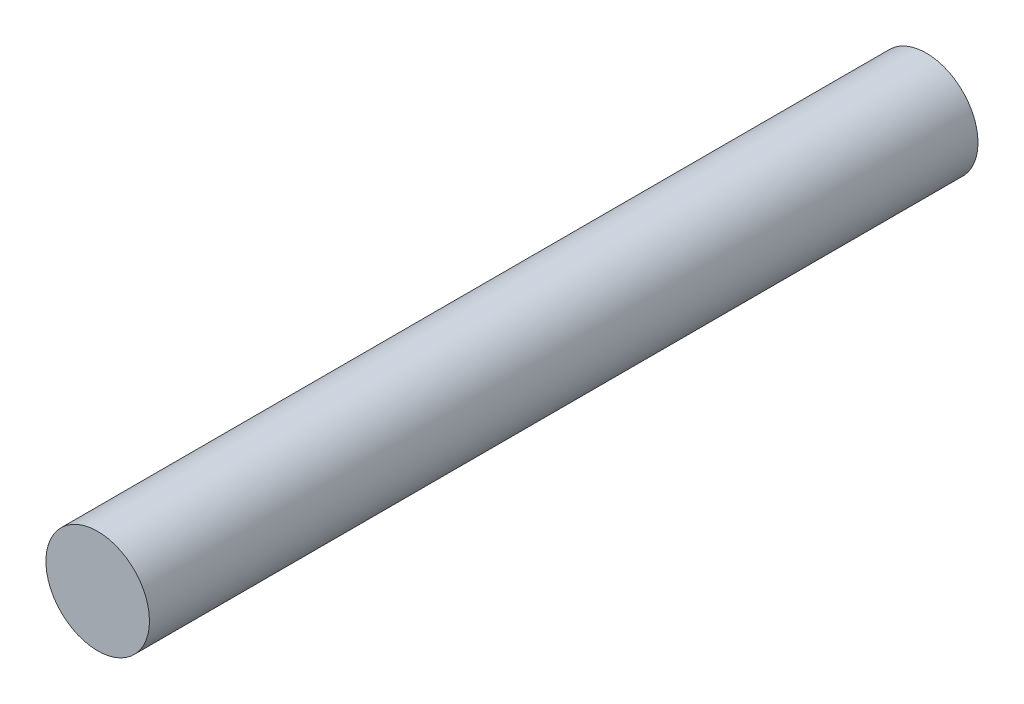
ISO-10303-21;
HEADER;
FILE_DESCRIPTION(('STEP AP214'),'2;1');
FILE_NAME('part.step','',(''),(''),'','','');
FILE_SCHEMA(('AUTOMOTIVE_DESIGN { 1 0 10303 214 1 1 1 1 }'));
ENDSEC;
DATA;
#1=APPLICATION_CONTEXT('core data for automotive mechanical design processes');
#2=APPLICATION_PROTOCOL_DEFINITION('international standard','automotive_design',2000,#1);
#3=PRODUCT_CONTEXT('',#1,'mechanical');
#4=PRODUCT('Part','Part','',(#3));
#5=PRODUCT_RELATED_PRODUCT_CATEGORY('part','',(#4));
#6=PRODUCT_DEFINITION_FORMATION('','',#4);
#7=PRODUCT_DEFINITION_CONTEXT('part definition',#1,'design');
#8=PRODUCT_DEFINITION('design','',#6,#7);
#9=PRODUCT_DEFINITION_SHAPE('','',#8);
#10=(LENGTH_UNIT() NAMED_UNIT(*) SI_UNIT(.MILLI.,.METRE.));
#11=(NAMED_UNIT(*) PLANE_ANGLE_UNIT() SI_UNIT($,.RADIAN.));
#12=(NAMED_UNIT(*) SI_UNIT($,.STERADIAN.) SOLID_ANGLE_UNIT());
#13=UNCERTAINTY_MEASURE_WITH_UNIT(LENGTH_MEASURE(1.E-05),#10,'distance_accuracy_value','');
#14=(GEOMETRIC_REPRESENTATION_CONTEXT(3) GLOBAL_UNCERTAINTY_ASSIGNED_CONTEXT((#13)) GLOBAL_UNIT_ASSIGNED_CONTEXT((#10,
#11,#12)) REPRESENTATION_CONTEXT('',''));
#15=CARTESIAN_POINT('',(0.,0.,0.));
#16=DIRECTION('',(0.,0.,1.));
#17=DIRECTION('',(1.,0.,0.));
#18=AXIS2_PLACEMENT_3D('',#15,#16,#17);
#19=CARTESIAN_POINT('',(0.,0.,25.4));
#20=DIRECTION('',(0.,0.,-1.));
#21=DIRECTION('',(-1.,0.,0.));
#22=AXIS2_PLACEMENT_3D('',#19,#20,#21);
#23=CYLINDRICAL_SURFACE('',#22,1.5875);
#24=CARTESIAN_POINT('',(0.,0.,25.4));
#25=DIRECTION('',(0.,0.,1.));
#26=DIRECTION('',(1.,0.,0.));
#27=AXIS2_PLACEMENT_3D('',#24,#25,#26);
#28=CIRCLE('',#27,1.5875);
#29=CARTESIAN_POINT('',(1.5875,0.,25.4));
#30=VERTEX_POINT('',#29);
#31=EDGE_CURVE('E10',#30,#30,#28,.T.);
#32=ORIENTED_EDGE('',*,*,#31,.F.);
#33=EDGE_LOOP('',(#32));
#34=FACE_BOUND('',#33,.T.);
#35=CARTESIAN_POINT('',(0.,0.,0.));
#36=DIRECTION('',(0.,0.,1.));
#37=DIRECTION('',(1.,0.,0.));
#38=AXIS2_PLACEMENT_3D('',#35,#36,#37);
#39=CIRCLE('',#38,1.5875);
#40=CARTESIAN_POINT('',(1.5875,0.,0.));
#41=VERTEX_POINT('',#40);
#42=EDGE_CURVE('E45',#41,#41,#39,.T.);
#43=ORIENTED_EDGE('',*,*,#42,.T.);
#44=EDGE_LOOP('',(#43));
#45=FACE_BOUND('',#44,.T.);
#46=ADVANCED_FACE('F39',(#34,#45),#23,.T.);
#47=CARTESIAN_POINT('',(0.,0.,25.4));
#48=DIRECTION('',(0.,0.,1.));
#49=DIRECTION('',(1.,0.,0.));
#50=AXIS2_PLACEMENT_3D('',#47,#48,#49);
#51=PLANE('',#50);
#52=ORIENTED_EDGE('',*,*,#31,.T.);
#53=EDGE_LOOP('',(#52));
#54=FACE_BOUND('',#53,.T.);
#55=ADVANCED_FACE('F66',(#54),#51,.T.);
#56=CARTESIAN_POINT('',(0.,0.,0.));
#57=DIRECTION('',(0.,0.,1.));
#58=DIRECTION('',(1.,0.,0.));
#59=AXIS2_PLACEMENT_3D('',#56,#57,#58);
#60=PLANE('',#59);
#61=CARTESIAN_POINT('',(0.,0.,0.));
#62=DIRECTION('',(0.,0.,-1.));
#63=DIRECTION('',(-1.,0.,0.));
#64=AXIS2_PLACEMENT_3D('',#61,#62,#63);
#65=CIRCLE('',#64,1.016);
#66=CARTESIAN_POINT('',(-1.016,0.,0.));
#67=VERTEX_POINT('',#66);
#68=EDGE_CURVE('E51',#67,#67,#65,.T.);
#69=ORIENTED_EDGE('',*,*,#68,.F.);
#70=EDGE_LOOP('',(#69));
#71=FACE_BOUND('',#70,.T.);
#72=ORIENTED_EDGE('',*,*,#42,.F.);
#73=EDGE_LOOP('',(#72));
#74=FACE_BOUND('',#73,.T.);
#75=ADVANCED_FACE('F65',(#71,#74),#60,.F.);
#76=CARTESIAN_POINT('',(0.,0.,5.08));
#77=DIRECTION('',(0.,0.,-1.));
#78=DIRECTION('',(-1.,0.,0.));
#79=AXIS2_PLACEMENT_3D('',#76,#77,#78);
#80=CYLINDRICAL_SURFACE('',#79,1.016);
#81=CARTESIAN_POINT('',(0.,0.,5.08));
#82=DIRECTION('',(0.,0.,-1.));
#83=DIRECTION('',(-1.,0.,0.));
#84=AXIS2_PLACEMENT_3D('',#81,#82,#83);
#85=CIRCLE('',#84,1.016);
#86=CARTESIAN_POINT('',(-1.016,0.,5.08));
#87=VERTEX_POINT('',#86);
#88=EDGE_CURVE('E47',#87,#87,#85,.T.);
#89=ORIENTED_EDGE('',*,*,#88,.F.);
#90=EDGE_LOOP('',(#89));
#91=FACE_BOUND('',#90,.T.);
#92=ORIENTED_EDGE('',*,*,#68,.T.);
#93=EDGE_LOOP('',(#92));
#94=FACE_BOUND('',#93,.T.);
#95=ADVANCED_FACE('F56',(#91,#94),#80,.F.);
#96=CARTESIAN_POINT('',(0.,0.,5.08));
#97=DIRECTION('',(0.,0.,-1.));
#98=DIRECTION('',(-1.,0.,0.));
#99=AXIS2_PLACEMENT_3D('',#96,#97,#98);
#100=PLANE('',#99);
#101=ORIENTED_EDGE('',*,*,#88,.T.);
#102=EDGE_LOOP('',(#101));
#103=FACE_BOUND('',#102,.T.);
#104=ADVANCED_FACE('F60',(#103),#100,.T.);
#105=CLOSED_SHELL('',(#46,#55,#75,#95,#104));
#106=MANIFOLD_SOLID_BREP('B2',#105);
#107=ADVANCED_BREP_SHAPE_REPRESENTATION('',(#18,#106),#14);
#108=SHAPE_DEFINITION_REPRESENTATION(#9,#107);
ENDSEC;
END-ISO-10303-21;
